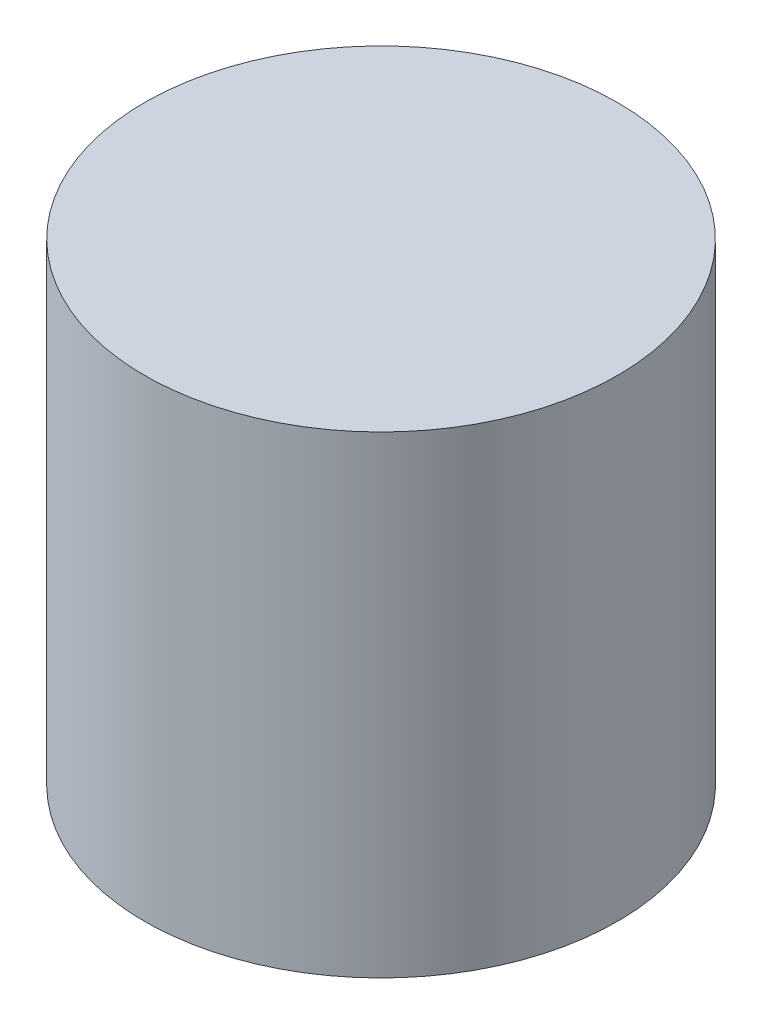
ISO-10303-21;
HEADER;
FILE_DESCRIPTION(('STEP AP214'),'2;1');
FILE_NAME('part.step','',(''),(''),'','','');
FILE_SCHEMA(('AUTOMOTIVE_DESIGN { 1 0 10303 214 1 1 1 1 }'));
ENDSEC;
DATA;
#1=APPLICATION_CONTEXT('core data for automotive mechanical design processes');
#2=APPLICATION_PROTOCOL_DEFINITION('international standard','automotive_design',2000,#1);
#3=PRODUCT_CONTEXT('',#1,'mechanical');
#4=PRODUCT('Part','Part','',(#3));
#5=PRODUCT_RELATED_PRODUCT_CATEGORY('part','',(#4));
#6=PRODUCT_DEFINITION_FORMATION('','',#4);
#7=PRODUCT_DEFINITION_CONTEXT('part definition',#1,'design');
#8=PRODUCT_DEFINITION('design','',#6,#7);
#9=PRODUCT_DEFINITION_SHAPE('','',#8);
#10=(LENGTH_UNIT() NAMED_UNIT(*) SI_UNIT(.MILLI.,.METRE.));
#11=(NAMED_UNIT(*) PLANE_ANGLE_UNIT() SI_UNIT($,.RADIAN.));
#12=(NAMED_UNIT(*) SI_UNIT($,.STERADIAN.) SOLID_ANGLE_UNIT());
#13=UNCERTAINTY_MEASURE_WITH_UNIT(LENGTH_MEASURE(1.E-05),#10,'distance_accuracy_value','');
#14=(GEOMETRIC_REPRESENTATION_CONTEXT(3) GLOBAL_UNCERTAINTY_ASSIGNED_CONTEXT((#13)) GLOBAL_UNIT_ASSIGNED_CONTEXT((#10,
#11,#12)) REPRESENTATION_CONTEXT('',''));
#15=CARTESIAN_POINT('',(0.,0.,0.));
#16=DIRECTION('',(0.,0.,1.));
#17=DIRECTION('',(1.,0.,0.));
#18=AXIS2_PLACEMENT_3D('',#15,#16,#17);
#19=CARTESIAN_POINT('',(0.,0.,0.));
#20=DIRECTION('',(0.,-1.,0.));
#21=DIRECTION('',(0.,0.,-1.));
#22=AXIS2_PLACEMENT_3D('',#19,#20,#21);
#23=CYLINDRICAL_SURFACE('',#22,14.);
#24=CARTESIAN_POINT('',(0.,30.,0.));
#25=DIRECTION('',(0.,-1.,0.));
#26=DIRECTION('',(0.,0.,-1.));
#27=AXIS2_PLACEMENT_3D('',#24,#25,#26);
#28=CIRCLE('',#27,14.);
#29=CARTESIAN_POINT('',(0.,30.,-14.));
#30=VERTEX_POINT('',#29);
#31=EDGE_CURVE('E47',#30,#30,#28,.T.);
#32=ORIENTED_EDGE('',*,*,#31,.F.);
#33=EDGE_LOOP('',(#32));
#34=FACE_BOUND('',#33,.T.);
#35=CARTESIAN_POINT('',(0.,0.,0.));
#36=DIRECTION('',(0.,-1.,0.));
#37=DIRECTION('',(0.,0.,-1.));
#38=AXIS2_PLACEMENT_3D('',#35,#36,#37);
#39=CIRCLE('',#38,14.);
#40=CARTESIAN_POINT('',(0.,0.,-14.));
#41=VERTEX_POINT('',#40);
#42=EDGE_CURVE('E10',#41,#41,#39,.T.);
#43=ORIENTED_EDGE('',*,*,#42,.T.);
#44=EDGE_LOOP('',(#43));
#45=FACE_BOUND('',#44,.T.);
#46=ADVANCED_FACE('F33',(#34,#45),#23,.F.);
#47=CARTESIAN_POINT('',(-14.,0.,0.));
#48=DIRECTION('',(0.,1.,0.));
#49=DIRECTION('',(0.,0.,1.));
#50=AXIS2_PLACEMENT_3D('',#47,#48,#49);
#51=PLANE('',#50);
#52=ORIENTED_EDGE('',*,*,#42,.F.);
#53=EDGE_LOOP('',(#52));
#54=FACE_BOUND('',#53,.T.);
#55=CARTESIAN_POINT('',(0.,0.,0.));
#56=DIRECTION('',(0.,-1.,0.));
#57=DIRECTION('',(0.,0.,-1.));
#58=AXIS2_PLACEMENT_3D('',#55,#56,#57);
#59=CIRCLE('',#58,16.);
#60=CARTESIAN_POINT('',(0.,0.,-16.));
#61=VERTEX_POINT('',#60);
#62=EDGE_CURVE('E39',#61,#61,#59,.T.);
#63=ORIENTED_EDGE('',*,*,#62,.T.);
#64=EDGE_LOOP('',(#63));
#65=FACE_BOUND('',#64,.T.);
#66=ADVANCED_FACE('F56',(#54,#65),#51,.F.);
#67=CARTESIAN_POINT('',(0.,0.,0.));
#68=DIRECTION('',(0.,-1.,0.));
#69=DIRECTION('',(0.,0.,-1.));
#70=AXIS2_PLACEMENT_3D('',#67,#68,#69);
#71=CYLINDRICAL_SURFACE('',#70,16.);
#72=ORIENTED_EDGE('',*,*,#62,.F.);
#73=EDGE_LOOP('',(#72));
#74=FACE_BOUND('',#73,.T.);
#75=CARTESIAN_POINT('',(0.,32.,0.));
#76=DIRECTION('',(0.,-1.,0.));
#77=DIRECTION('',(0.,0.,-1.));
#78=AXIS2_PLACEMENT_3D('',#75,#76,#77);
#79=CIRCLE('',#78,16.);
#80=CARTESIAN_POINT('',(0.,32.,-16.));
#81=VERTEX_POINT('',#80);
#82=EDGE_CURVE('E43',#81,#81,#79,.T.);
#83=ORIENTED_EDGE('',*,*,#82,.T.);
#84=EDGE_LOOP('',(#83));
#85=FACE_BOUND('',#84,.T.);
#86=ADVANCED_FACE('F60',(#74,#85),#71,.T.);
#87=CARTESIAN_POINT('',(-16.,32.,0.));
#88=DIRECTION('',(0.,-1.,0.));
#89=DIRECTION('',(0.,0.,-1.));
#90=AXIS2_PLACEMENT_3D('',#87,#88,#89);
#91=PLANE('',#90);
#92=ORIENTED_EDGE('',*,*,#82,.F.);
#93=EDGE_LOOP('',(#92));
#94=FACE_BOUND('',#93,.T.);
#95=ADVANCED_FACE('F65',(#94),#91,.F.);
#96=CARTESIAN_POINT('',(-14.,30.,0.));
#97=DIRECTION('',(0.,1.,0.));
#98=DIRECTION('',(0.,0.,1.));
#99=AXIS2_PLACEMENT_3D('',#96,#97,#98);
#100=PLANE('',#99);
#101=ORIENTED_EDGE('',*,*,#31,.T.);
#102=EDGE_LOOP('',(#101));
#103=FACE_BOUND('',#102,.T.);
#104=ADVANCED_FACE('F53',(#103),#100,.F.);
#105=CLOSED_SHELL('',(#46,#66,#86,#95,#104));
#106=MANIFOLD_SOLID_BREP('B2',#105);
#107=ADVANCED_BREP_SHAPE_REPRESENTATION('',(#18,#106),#14);
#108=SHAPE_DEFINITION_REPRESENTATION(#9,#107);
ENDSEC;
END-ISO-10303-21;
